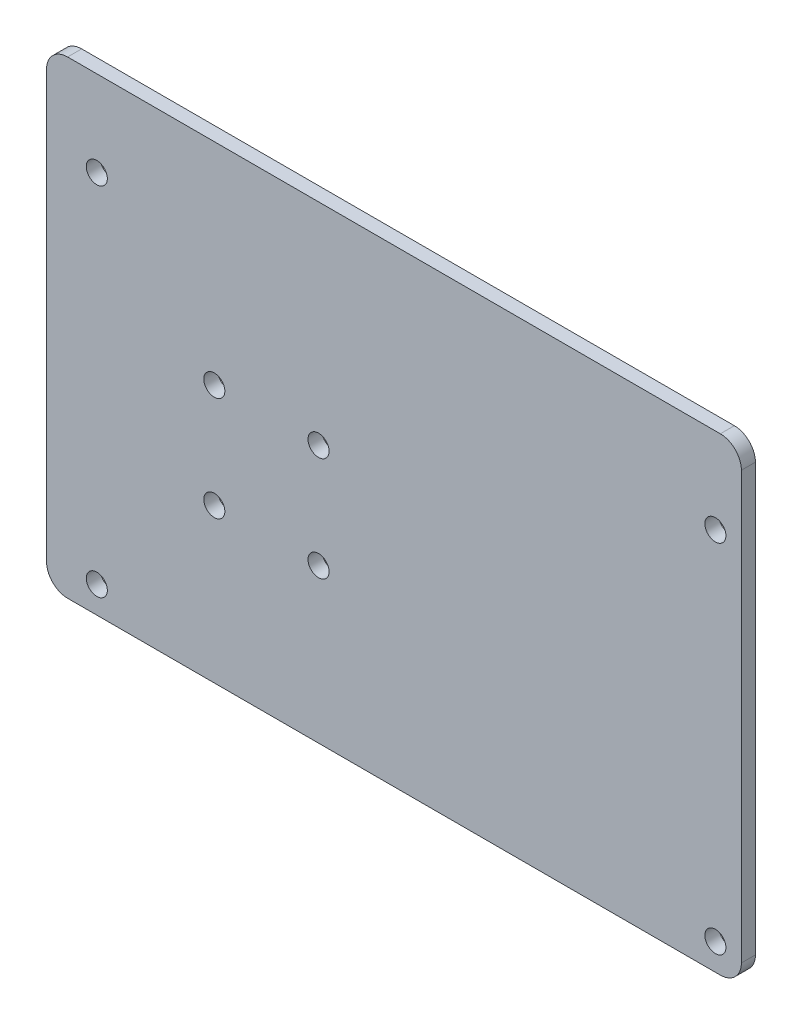
ISO-10303-21;
HEADER;
FILE_DESCRIPTION(('STEP AP214'),'2;1');
FILE_NAME('part.step','',(''),(''),'','','');
FILE_SCHEMA(('AUTOMOTIVE_DESIGN { 1 0 10303 214 1 1 1 1 }'));
ENDSEC;
DATA;
#1=APPLICATION_CONTEXT('core data for automotive mechanical design processes');
#2=APPLICATION_PROTOCOL_DEFINITION('international standard','automotive_design',2000,#1);
#3=PRODUCT_CONTEXT('',#1,'mechanical');
#4=PRODUCT('Part','Part','',(#3));
#5=PRODUCT_RELATED_PRODUCT_CATEGORY('part','',(#4));
#6=PRODUCT_DEFINITION_FORMATION('','',#4);
#7=PRODUCT_DEFINITION_CONTEXT('part definition',#1,'design');
#8=PRODUCT_DEFINITION('design','',#6,#7);
#9=PRODUCT_DEFINITION_SHAPE('','',#8);
#10=(LENGTH_UNIT() NAMED_UNIT(*) SI_UNIT(.MILLI.,.METRE.));
#11=(NAMED_UNIT(*) PLANE_ANGLE_UNIT() SI_UNIT($,.RADIAN.));
#12=(NAMED_UNIT(*) SI_UNIT($,.STERADIAN.) SOLID_ANGLE_UNIT());
#13=UNCERTAINTY_MEASURE_WITH_UNIT(LENGTH_MEASURE(1.E-05),#10,'distance_accuracy_value','');
#14=(GEOMETRIC_REPRESENTATION_CONTEXT(3) GLOBAL_UNCERTAINTY_ASSIGNED_CONTEXT((#13)) GLOBAL_UNIT_ASSIGNED_CONTEXT((#10,
#11,#12)) REPRESENTATION_CONTEXT('',''));
#15=CARTESIAN_POINT('',(0.,0.,0.));
#16=DIRECTION('',(0.,0.,1.));
#17=DIRECTION('',(1.,0.,0.));
#18=AXIS2_PLACEMENT_3D('',#15,#16,#17);
#19=CARTESIAN_POINT('',(43.9295938104449,23.2936170212766,2.));
#20=DIRECTION('',(0.,0.,-1.));
#21=DIRECTION('',(-1.,0.,0.));
#22=AXIS2_PLACEMENT_3D('',#19,#20,#21);
#23=CYLINDRICAL_SURFACE('',#22,3.);
#24=CARTESIAN_POINT('',(43.9295938104449,23.2936170212766,0.));
#25=DIRECTION('',(0.,0.,1.));
#26=DIRECTION('',(1.,0.,0.));
#27=AXIS2_PLACEMENT_3D('',#24,#25,#26);
#28=CIRCLE('',#27,3.);
#29=CARTESIAN_POINT('',(46.9295938104449,23.2936170212766,0.));
#30=VERTEX_POINT('',#29);
#31=CARTESIAN_POINT('',(43.9295938104449,26.2936170212766,0.));
#32=VERTEX_POINT('',#31);
#33=EDGE_CURVE('E141',#30,#32,#28,.T.);
#34=ORIENTED_EDGE('',*,*,#33,.T.);
#35=DIRECTION('',(0.,0.,-1.));
#36=VECTOR('',#35,1.);
#37=CARTESIAN_POINT('',(43.9295938104449,26.2936170212766,2.));
#38=LINE('',#37,#36);
#39=CARTESIAN_POINT('',(43.9295938104449,26.2936170212766,2.));
#40=VERTEX_POINT('',#39);
#41=EDGE_CURVE('E11',#40,#32,#38,.T.);
#42=ORIENTED_EDGE('',*,*,#41,.F.);
#43=CARTESIAN_POINT('',(43.9295938104449,23.2936170212766,2.));
#44=DIRECTION('',(0.,0.,1.));
#45=DIRECTION('',(1.,0.,0.));
#46=AXIS2_PLACEMENT_3D('',#43,#44,#45);
#47=CIRCLE('',#46,3.);
#48=CARTESIAN_POINT('',(46.9295938104449,23.2936170212766,2.));
#49=VERTEX_POINT('',#48);
#50=EDGE_CURVE('E156',#49,#40,#47,.T.);
#51=ORIENTED_EDGE('',*,*,#50,.F.);
#52=DIRECTION('',(0.,0.,-1.));
#53=VECTOR('',#52,1.);
#54=CARTESIAN_POINT('',(46.9295938104449,23.2936170212766,2.));
#55=LINE('',#54,#53);
#56=EDGE_CURVE('E137',#49,#30,#55,.T.);
#57=ORIENTED_EDGE('',*,*,#56,.T.);
#58=EDGE_LOOP('',(#34,#42,#51,#57));
#59=FACE_BOUND('',#58,.T.);
#60=ADVANCED_FACE('F45',(#59),#23,.T.);
#61=CARTESIAN_POINT('',(-49.0704061895551,26.2936170212766,2.));
#62=DIRECTION('',(0.,-1.,0.));
#63=DIRECTION('',(0.,0.,-1.));
#64=AXIS2_PLACEMENT_3D('',#61,#62,#63);
#65=PLANE('',#64);
#66=DIRECTION('',(-1.,0.,0.));
#67=VECTOR('',#66,1.);
#68=CARTESIAN_POINT('',(-49.0704061895551,26.2936170212766,0.));
#69=LINE('',#68,#67);
#70=CARTESIAN_POINT('',(-49.0704061895551,26.2936170212766,0.));
#71=VERTEX_POINT('',#70);
#72=EDGE_CURVE('E144',#32,#71,#69,.T.);
#73=ORIENTED_EDGE('',*,*,#72,.T.);
#74=DIRECTION('',(0.,0.,-1.));
#75=VECTOR('',#74,1.);
#76=CARTESIAN_POINT('',(-49.0704061895551,26.2936170212766,2.));
#77=LINE('',#76,#75);
#78=CARTESIAN_POINT('',(-49.0704061895551,26.2936170212766,2.));
#79=VERTEX_POINT('',#78);
#80=EDGE_CURVE('E53',#79,#71,#77,.T.);
#81=ORIENTED_EDGE('',*,*,#80,.F.);
#82=DIRECTION('',(-1.,0.,0.));
#83=VECTOR('',#82,1.);
#84=CARTESIAN_POINT('',(-49.0704061895551,26.2936170212766,2.));
#85=LINE('',#84,#83);
#86=EDGE_CURVE('E104',#40,#79,#85,.T.);
#87=ORIENTED_EDGE('',*,*,#86,.F.);
#88=ORIENTED_EDGE('',*,*,#41,.T.);
#89=EDGE_LOOP('',(#73,#81,#87,#88));
#90=FACE_BOUND('',#89,.T.);
#91=ADVANCED_FACE('F267',(#90),#65,.F.);
#92=CARTESIAN_POINT('',(-49.0704061895551,23.2936170212766,2.));
#93=DIRECTION('',(0.,0.,-1.));
#94=DIRECTION('',(-1.,0.,0.));
#95=AXIS2_PLACEMENT_3D('',#92,#93,#94);
#96=CYLINDRICAL_SURFACE('',#95,3.);
#97=CARTESIAN_POINT('',(-49.0704061895551,23.2936170212766,0.));
#98=DIRECTION('',(0.,0.,1.));
#99=DIRECTION('',(-1.,0.,0.));
#100=AXIS2_PLACEMENT_3D('',#97,#98,#99);
#101=CIRCLE('',#100,3.);
#102=CARTESIAN_POINT('',(-52.0704061895551,23.2936170212766,0.));
#103=VERTEX_POINT('',#102);
#104=EDGE_CURVE('E147',#71,#103,#101,.T.);
#105=ORIENTED_EDGE('',*,*,#104,.T.);
#106=DIRECTION('',(0.,0.,-1.));
#107=VECTOR('',#106,1.);
#108=CARTESIAN_POINT('',(-52.0704061895551,23.2936170212766,2.));
#109=LINE('',#108,#107);
#110=CARTESIAN_POINT('',(-52.0704061895551,23.2936170212766,2.));
#111=VERTEX_POINT('',#110);
#112=EDGE_CURVE('E163',#111,#103,#109,.T.);
#113=ORIENTED_EDGE('',*,*,#112,.F.);
#114=CARTESIAN_POINT('',(-49.0704061895551,23.2936170212766,2.));
#115=DIRECTION('',(0.,0.,1.));
#116=DIRECTION('',(-1.,0.,0.));
#117=AXIS2_PLACEMENT_3D('',#114,#115,#116);
#118=CIRCLE('',#117,3.);
#119=EDGE_CURVE('E171',#79,#111,#118,.T.);
#120=ORIENTED_EDGE('',*,*,#119,.F.);
#121=ORIENTED_EDGE('',*,*,#80,.T.);
#122=EDGE_LOOP('',(#105,#113,#120,#121));
#123=FACE_BOUND('',#122,.T.);
#124=ADVANCED_FACE('F169',(#123),#96,.T.);
#125=CARTESIAN_POINT('',(-52.0704061895551,23.2936170212766,2.));
#126=DIRECTION('',(1.,0.,0.));
#127=DIRECTION('',(0.,0.,-1.));
#128=AXIS2_PLACEMENT_3D('',#125,#126,#127);
#129=PLANE('',#128);
#130=DIRECTION('',(0.,-1.,0.));
#131=VECTOR('',#130,1.);
#132=CARTESIAN_POINT('',(-52.0704061895551,23.2936170212766,0.));
#133=LINE('',#132,#131);
#134=CARTESIAN_POINT('',(-52.0704061895551,-37.5063829787234,0.));
#135=VERTEX_POINT('',#134);
#136=EDGE_CURVE('E149',#103,#135,#133,.T.);
#137=ORIENTED_EDGE('',*,*,#136,.T.);
#138=DIRECTION('',(0.,0.,-1.));
#139=VECTOR('',#138,1.);
#140=CARTESIAN_POINT('',(-52.0704061895551,-37.5063829787234,2.));
#141=LINE('',#140,#139);
#142=CARTESIAN_POINT('',(-52.0704061895551,-37.5063829787234,2.));
#143=VERTEX_POINT('',#142);
#144=EDGE_CURVE('E160',#143,#135,#141,.T.);
#145=ORIENTED_EDGE('',*,*,#144,.F.);
#146=DIRECTION('',(0.,-1.,0.));
#147=VECTOR('',#146,1.);
#148=CARTESIAN_POINT('',(-52.0704061895551,23.2936170212766,2.));
#149=LINE('',#148,#147);
#150=EDGE_CURVE('E183',#111,#143,#149,.T.);
#151=ORIENTED_EDGE('',*,*,#150,.F.);
#152=ORIENTED_EDGE('',*,*,#112,.T.);
#153=EDGE_LOOP('',(#137,#145,#151,#152));
#154=FACE_BOUND('',#153,.T.);
#155=ADVANCED_FACE('F179',(#154),#129,.F.);
#156=CARTESIAN_POINT('',(-49.0704061895551,-37.5063829787234,2.));
#157=DIRECTION('',(0.,0.,-1.));
#158=DIRECTION('',(-1.,0.,0.));
#159=AXIS2_PLACEMENT_3D('',#156,#157,#158);
#160=CYLINDRICAL_SURFACE('',#159,3.);
#161=CARTESIAN_POINT('',(-49.0704061895551,-37.5063829787234,0.));
#162=DIRECTION('',(0.,0.,1.));
#163=DIRECTION('',(-1.,0.,0.));
#164=AXIS2_PLACEMENT_3D('',#161,#162,#163);
#165=CIRCLE('',#164,3.);
#166=CARTESIAN_POINT('',(-49.0704061895551,-40.5063829787234,0.));
#167=VERTEX_POINT('',#166);
#168=EDGE_CURVE('E151',#135,#167,#165,.T.);
#169=ORIENTED_EDGE('',*,*,#168,.T.);
#170=DIRECTION('',(0.,0.,-1.));
#171=VECTOR('',#170,1.);
#172=CARTESIAN_POINT('',(-49.0704061895551,-40.5063829787234,2.));
#173=LINE('',#172,#171);
#174=CARTESIAN_POINT('',(-49.0704061895551,-40.5063829787234,2.));
#175=VERTEX_POINT('',#174);
#176=EDGE_CURVE('E132',#175,#167,#173,.T.);
#177=ORIENTED_EDGE('',*,*,#176,.F.);
#178=CARTESIAN_POINT('',(-49.0704061895551,-37.5063829787234,2.));
#179=DIRECTION('',(0.,0.,1.));
#180=DIRECTION('',(-1.,0.,0.));
#181=AXIS2_PLACEMENT_3D('',#178,#179,#180);
#182=CIRCLE('',#181,3.);
#183=EDGE_CURVE('E123',#143,#175,#182,.T.);
#184=ORIENTED_EDGE('',*,*,#183,.F.);
#185=ORIENTED_EDGE('',*,*,#144,.T.);
#186=EDGE_LOOP('',(#169,#177,#184,#185));
#187=FACE_BOUND('',#186,.T.);
#188=ADVANCED_FACE('F182',(#187),#160,.T.);
#189=CARTESIAN_POINT('',(-49.0704061895551,-40.5063829787234,2.));
#190=DIRECTION('',(0.,1.,0.));
#191=DIRECTION('',(-1.,0.,0.));
#192=AXIS2_PLACEMENT_3D('',#189,#190,#191);
#193=PLANE('',#192);
#194=DIRECTION('',(1.,0.,0.));
#195=VECTOR('',#194,1.);
#196=CARTESIAN_POINT('',(-49.0704061895551,-40.5063829787234,0.));
#197=LINE('',#196,#195);
#198=CARTESIAN_POINT('',(43.9295938104449,-40.5063829787234,0.));
#199=VERTEX_POINT('',#198);
#200=EDGE_CURVE('E131',#167,#199,#197,.T.);
#201=ORIENTED_EDGE('',*,*,#200,.T.);
#202=DIRECTION('',(0.,0.,-1.));
#203=VECTOR('',#202,1.);
#204=CARTESIAN_POINT('',(43.9295938104449,-40.5063829787234,2.));
#205=LINE('',#204,#203);
#206=CARTESIAN_POINT('',(43.9295938104449,-40.5063829787234,2.));
#207=VERTEX_POINT('',#206);
#208=EDGE_CURVE('E128',#207,#199,#205,.T.);
#209=ORIENTED_EDGE('',*,*,#208,.F.);
#210=DIRECTION('',(1.,0.,0.));
#211=VECTOR('',#210,1.);
#212=CARTESIAN_POINT('',(-49.0704061895551,-40.5063829787234,2.));
#213=LINE('',#212,#211);
#214=EDGE_CURVE('E117',#175,#207,#213,.T.);
#215=ORIENTED_EDGE('',*,*,#214,.F.);
#216=ORIENTED_EDGE('',*,*,#176,.T.);
#217=EDGE_LOOP('',(#201,#209,#215,#216));
#218=FACE_BOUND('',#217,.T.);
#219=ADVANCED_FACE('F129',(#218),#193,.F.);
#220=CARTESIAN_POINT('',(43.9295938104449,-37.5063829787234,2.));
#221=DIRECTION('',(0.,0.,-1.));
#222=DIRECTION('',(-1.,0.,0.));
#223=AXIS2_PLACEMENT_3D('',#220,#221,#222);
#224=CYLINDRICAL_SURFACE('',#223,3.);
#225=CARTESIAN_POINT('',(43.9295938104449,-37.5063829787234,0.));
#226=DIRECTION('',(0.,0.,1.));
#227=DIRECTION('',(1.,0.,0.));
#228=AXIS2_PLACEMENT_3D('',#225,#226,#227);
#229=CIRCLE('',#228,3.);
#230=CARTESIAN_POINT('',(46.9295938104449,-37.5063829787234,0.));
#231=VERTEX_POINT('',#230);
#232=EDGE_CURVE('E90',#199,#231,#229,.T.);
#233=ORIENTED_EDGE('',*,*,#232,.T.);
#234=DIRECTION('',(0.,0.,-1.));
#235=VECTOR('',#234,1.);
#236=CARTESIAN_POINT('',(46.9295938104449,-37.5063829787234,2.));
#237=LINE('',#236,#235);
#238=CARTESIAN_POINT('',(46.9295938104449,-37.5063829787234,2.));
#239=VERTEX_POINT('',#238);
#240=EDGE_CURVE('E133',#239,#231,#237,.T.);
#241=ORIENTED_EDGE('',*,*,#240,.F.);
#242=CARTESIAN_POINT('',(43.9295938104449,-37.5063829787234,2.));
#243=DIRECTION('',(0.,0.,1.));
#244=DIRECTION('',(1.,0.,0.));
#245=AXIS2_PLACEMENT_3D('',#242,#243,#244);
#246=CIRCLE('',#245,3.);
#247=EDGE_CURVE('E121',#207,#239,#246,.T.);
#248=ORIENTED_EDGE('',*,*,#247,.F.);
#249=ORIENTED_EDGE('',*,*,#208,.T.);
#250=EDGE_LOOP('',(#233,#241,#248,#249));
#251=FACE_BOUND('',#250,.T.);
#252=ADVANCED_FACE('F135',(#251),#224,.T.);
#253=CARTESIAN_POINT('',(46.9295938104449,23.2936170212766,2.));
#254=DIRECTION('',(-1.,0.,0.));
#255=DIRECTION('',(0.,-1.,0.));
#256=AXIS2_PLACEMENT_3D('',#253,#254,#255);
#257=PLANE('',#256);
#258=DIRECTION('',(0.,1.,0.));
#259=VECTOR('',#258,1.);
#260=CARTESIAN_POINT('',(46.9295938104449,23.2936170212766,0.));
#261=LINE('',#260,#259);
#262=EDGE_CURVE('E96',#231,#30,#261,.T.);
#263=ORIENTED_EDGE('',*,*,#262,.T.);
#264=ORIENTED_EDGE('',*,*,#56,.F.);
#265=DIRECTION('',(0.,1.,0.));
#266=VECTOR('',#265,1.);
#267=CARTESIAN_POINT('',(46.9295938104449,23.2936170212766,2.));
#268=LINE('',#267,#266);
#269=EDGE_CURVE('E61',#239,#49,#268,.T.);
#270=ORIENTED_EDGE('',*,*,#269,.F.);
#271=ORIENTED_EDGE('',*,*,#240,.T.);
#272=EDGE_LOOP('',(#263,#264,#270,#271));
#273=FACE_BOUND('',#272,.T.);
#274=ADVANCED_FACE('F241',(#273),#257,.F.);
#275=CARTESIAN_POINT('',(43.9295938104449,23.2936170212766,2.));
#276=DIRECTION('',(0.,0.,1.));
#277=DIRECTION('',(1.,0.,0.));
#278=AXIS2_PLACEMENT_3D('',#275,#276,#277);
#279=PLANE('',#278);
#280=CARTESIAN_POINT('',(-44.9144061895551,14.1016170212766,2.));
#281=DIRECTION('',(0.,0.,1.));
#282=DIRECTION('',(1.,0.,0.));
#283=AXIS2_PLACEMENT_3D('',#280,#281,#282);
#284=CIRCLE('',#283,1.5);
#285=CARTESIAN_POINT('',(-43.4144061895551,14.1016170212766,2.));
#286=VERTEX_POINT('',#285);
#287=EDGE_CURVE('E192',#286,#286,#284,.T.);
#288=ORIENTED_EDGE('',*,*,#287,.F.);
#289=EDGE_LOOP('',(#288));
#290=FACE_BOUND('',#289,.T.);
#291=CARTESIAN_POINT('',(-44.9144061895551,-36.6983829787234,2.));
#292=DIRECTION('',(0.,0.,1.));
#293=DIRECTION('',(1.,0.,0.));
#294=AXIS2_PLACEMENT_3D('',#291,#292,#293);
#295=CIRCLE('',#294,1.5);
#296=CARTESIAN_POINT('',(-43.4144061895551,-36.6983829787234,2.));
#297=VERTEX_POINT('',#296);
#298=EDGE_CURVE('E211',#297,#297,#295,.T.);
#299=ORIENTED_EDGE('',*,*,#298,.F.);
#300=EDGE_LOOP('',(#299));
#301=FACE_BOUND('',#300,.T.);
#302=CARTESIAN_POINT('',(43.2255938104449,-36.6983829787234,2.));
#303=DIRECTION('',(0.,0.,1.));
#304=DIRECTION('',(1.,0.,0.));
#305=AXIS2_PLACEMENT_3D('',#302,#303,#304);
#306=CIRCLE('',#305,1.5);
#307=CARTESIAN_POINT('',(44.7255938104449,-36.6983829787234,2.));
#308=VERTEX_POINT('',#307);
#309=EDGE_CURVE('E205',#308,#308,#306,.T.);
#310=ORIENTED_EDGE('',*,*,#309,.F.);
#311=EDGE_LOOP('',(#310));
#312=FACE_BOUND('',#311,.T.);
#313=CARTESIAN_POINT('',(-28.1704061895551,-3.74514057380588,2.));
#314=DIRECTION('',(0.,0.,1.));
#315=DIRECTION('',(1.,0.,0.));
#316=AXIS2_PLACEMENT_3D('',#313,#314,#315);
#317=CIRCLE('',#316,1.5);
#318=CARTESIAN_POINT('',(-26.6704061895551,-3.74514057380588,2.));
#319=VERTEX_POINT('',#318);
#320=EDGE_CURVE('E198',#319,#319,#317,.T.);
#321=ORIENTED_EDGE('',*,*,#320,.F.);
#322=EDGE_LOOP('',(#321));
#323=FACE_BOUND('',#322,.T.);
#324=CARTESIAN_POINT('',(-13.3211637846376,-18.5943829787234,2.));
#325=DIRECTION('',(0.,0.,1.));
#326=DIRECTION('',(1.,0.,0.));
#327=AXIS2_PLACEMENT_3D('',#324,#325,#326);
#328=CIRCLE('',#327,1.5);
#329=CARTESIAN_POINT('',(-11.8211637846376,-18.5943829787234,2.));
#330=VERTEX_POINT('',#329);
#331=EDGE_CURVE('E223',#330,#330,#328,.T.);
#332=ORIENTED_EDGE('',*,*,#331,.F.);
#333=EDGE_LOOP('',(#332));
#334=FACE_BOUND('',#333,.T.);
#335=CARTESIAN_POINT('',(-13.3211637846376,-3.74514057380588,2.));
#336=DIRECTION('',(0.,0.,1.));
#337=DIRECTION('',(1.,0.,0.));
#338=AXIS2_PLACEMENT_3D('',#335,#336,#337);
#339=CIRCLE('',#338,1.5);
#340=CARTESIAN_POINT('',(-11.8211637846376,-3.74514057380588,2.));
#341=VERTEX_POINT('',#340);
#342=EDGE_CURVE('E222',#341,#341,#339,.T.);
#343=ORIENTED_EDGE('',*,*,#342,.F.);
#344=EDGE_LOOP('',(#343));
#345=FACE_BOUND('',#344,.T.);
#346=CARTESIAN_POINT('',(-28.1704061895551,-18.5943829787234,2.));
#347=DIRECTION('',(0.,0.,1.));
#348=DIRECTION('',(1.,0.,0.));
#349=AXIS2_PLACEMENT_3D('',#346,#347,#348);
#350=CIRCLE('',#349,1.5);
#351=CARTESIAN_POINT('',(-26.6704061895551,-18.5943829787234,2.));
#352=VERTEX_POINT('',#351);
#353=EDGE_CURVE('E199',#352,#352,#350,.T.);
#354=ORIENTED_EDGE('',*,*,#353,.F.);
#355=EDGE_LOOP('',(#354));
#356=FACE_BOUND('',#355,.T.);
#357=CARTESIAN_POINT('',(43.2255938104449,14.1016170212766,2.));
#358=DIRECTION('',(0.,0.,1.));
#359=DIRECTION('',(1.,0.,0.));
#360=AXIS2_PLACEMENT_3D('',#357,#358,#359);
#361=CIRCLE('',#360,1.5);
#362=CARTESIAN_POINT('',(44.7255938104449,14.1016170212766,2.));
#363=VERTEX_POINT('',#362);
#364=EDGE_CURVE('E189',#363,#363,#361,.T.);
#365=ORIENTED_EDGE('',*,*,#364,.F.);
#366=EDGE_LOOP('',(#365));
#367=FACE_BOUND('',#366,.T.);
#368=ORIENTED_EDGE('',*,*,#50,.T.);
#369=ORIENTED_EDGE('',*,*,#86,.T.);
#370=ORIENTED_EDGE('',*,*,#119,.T.);
#371=ORIENTED_EDGE('',*,*,#150,.T.);
#372=ORIENTED_EDGE('',*,*,#183,.T.);
#373=ORIENTED_EDGE('',*,*,#214,.T.);
#374=ORIENTED_EDGE('',*,*,#247,.T.);
#375=ORIENTED_EDGE('',*,*,#269,.T.);
#376=EDGE_LOOP('',(#368,#369,#370,#371,#372,#373,#374,#375));
#377=FACE_BOUND('',#376,.T.);
#378=ADVANCED_FACE('F119',(#290,#301,#312,#323,#334,#345,#356,#367,#377),#279,.T.);
#379=CARTESIAN_POINT('',(43.9295938104449,23.2936170212766,0.));
#380=DIRECTION('',(0.,0.,1.));
#381=DIRECTION('',(1.,0.,0.));
#382=AXIS2_PLACEMENT_3D('',#379,#380,#381);
#383=PLANE('',#382);
#384=CARTESIAN_POINT('',(-44.9144061895551,14.1016170212766,0.));
#385=DIRECTION('',(0.,0.,1.));
#386=DIRECTION('',(1.,0.,0.));
#387=AXIS2_PLACEMENT_3D('',#384,#385,#386);
#388=CIRCLE('',#387,1.5);
#389=CARTESIAN_POINT('',(-43.4144061895551,14.1016170212766,0.));
#390=VERTEX_POINT('',#389);
#391=EDGE_CURVE('E214',#390,#390,#388,.T.);
#392=ORIENTED_EDGE('',*,*,#391,.T.);
#393=EDGE_LOOP('',(#392));
#394=FACE_BOUND('',#393,.T.);
#395=CARTESIAN_POINT('',(-44.9144061895551,-36.6983829787234,0.));
#396=DIRECTION('',(0.,0.,1.));
#397=DIRECTION('',(1.,0.,0.));
#398=AXIS2_PLACEMENT_3D('',#395,#396,#397);
#399=CIRCLE('',#398,1.5);
#400=CARTESIAN_POINT('',(-43.4144061895551,-36.6983829787234,0.));
#401=VERTEX_POINT('',#400);
#402=EDGE_CURVE('E208',#401,#401,#399,.T.);
#403=ORIENTED_EDGE('',*,*,#402,.T.);
#404=EDGE_LOOP('',(#403));
#405=FACE_BOUND('',#404,.T.);
#406=CARTESIAN_POINT('',(43.2255938104449,-36.6983829787234,0.));
#407=DIRECTION('',(0.,0.,1.));
#408=DIRECTION('',(1.,0.,0.));
#409=AXIS2_PLACEMENT_3D('',#406,#407,#408);
#410=CIRCLE('',#409,1.5);
#411=CARTESIAN_POINT('',(44.7255938104449,-36.6983829787234,0.));
#412=VERTEX_POINT('',#411);
#413=EDGE_CURVE('E202',#412,#412,#410,.T.);
#414=ORIENTED_EDGE('',*,*,#413,.T.);
#415=EDGE_LOOP('',(#414));
#416=FACE_BOUND('',#415,.T.);
#417=CARTESIAN_POINT('',(-28.1704061895551,-3.74514057380588,0.));
#418=DIRECTION('',(0.,0.,1.));
#419=DIRECTION('',(1.,0.,0.));
#420=AXIS2_PLACEMENT_3D('',#417,#418,#419);
#421=CIRCLE('',#420,1.5);
#422=CARTESIAN_POINT('',(-26.6704061895551,-3.74514057380588,0.));
#423=VERTEX_POINT('',#422);
#424=EDGE_CURVE('E195',#423,#423,#421,.T.);
#425=ORIENTED_EDGE('',*,*,#424,.T.);
#426=EDGE_LOOP('',(#425));
#427=FACE_BOUND('',#426,.T.);
#428=CARTESIAN_POINT('',(-13.3211637846376,-18.5943829787234,0.));
#429=DIRECTION('',(0.,0.,1.));
#430=DIRECTION('',(1.,0.,0.));
#431=AXIS2_PLACEMENT_3D('',#428,#429,#430);
#432=CIRCLE('',#431,1.5);
#433=CARTESIAN_POINT('',(-11.8211637846376,-18.5943829787234,0.));
#434=VERTEX_POINT('',#433);
#435=EDGE_CURVE('E231',#434,#434,#432,.T.);
#436=ORIENTED_EDGE('',*,*,#435,.T.);
#437=EDGE_LOOP('',(#436));
#438=FACE_BOUND('',#437,.T.);
#439=CARTESIAN_POINT('',(-13.3211637846376,-3.74514057380588,0.));
#440=DIRECTION('',(0.,0.,1.));
#441=DIRECTION('',(1.,0.,0.));
#442=AXIS2_PLACEMENT_3D('',#439,#440,#441);
#443=CIRCLE('',#442,1.5);
#444=CARTESIAN_POINT('',(-11.8211637846376,-3.74514057380588,0.));
#445=VERTEX_POINT('',#444);
#446=EDGE_CURVE('E219',#445,#445,#443,.T.);
#447=ORIENTED_EDGE('',*,*,#446,.T.);
#448=EDGE_LOOP('',(#447));
#449=FACE_BOUND('',#448,.T.);
#450=CARTESIAN_POINT('',(-28.1704061895551,-18.5943829787234,0.));
#451=DIRECTION('',(0.,0.,1.));
#452=DIRECTION('',(1.,0.,0.));
#453=AXIS2_PLACEMENT_3D('',#450,#451,#452);
#454=CIRCLE('',#453,1.5);
#455=CARTESIAN_POINT('',(-26.6704061895551,-18.5943829787234,0.));
#456=VERTEX_POINT('',#455);
#457=EDGE_CURVE('E226',#456,#456,#454,.T.);
#458=ORIENTED_EDGE('',*,*,#457,.T.);
#459=EDGE_LOOP('',(#458));
#460=FACE_BOUND('',#459,.T.);
#461=CARTESIAN_POINT('',(43.2255938104449,14.1016170212766,0.));
#462=DIRECTION('',(0.,0.,1.));
#463=DIRECTION('',(1.,0.,0.));
#464=AXIS2_PLACEMENT_3D('',#461,#462,#463);
#465=CIRCLE('',#464,1.5);
#466=CARTESIAN_POINT('',(44.7255938104449,14.1016170212766,0.));
#467=VERTEX_POINT('',#466);
#468=EDGE_CURVE('E145',#467,#467,#465,.T.);
#469=ORIENTED_EDGE('',*,*,#468,.T.);
#470=EDGE_LOOP('',(#469));
#471=FACE_BOUND('',#470,.T.);
#472=ORIENTED_EDGE('',*,*,#33,.F.);
#473=ORIENTED_EDGE('',*,*,#262,.F.);
#474=ORIENTED_EDGE('',*,*,#232,.F.);
#475=ORIENTED_EDGE('',*,*,#200,.F.);
#476=ORIENTED_EDGE('',*,*,#168,.F.);
#477=ORIENTED_EDGE('',*,*,#136,.F.);
#478=ORIENTED_EDGE('',*,*,#104,.F.);
#479=ORIENTED_EDGE('',*,*,#72,.F.);
#480=EDGE_LOOP('',(#472,#473,#474,#475,#476,#477,#478,#479));
#481=FACE_BOUND('',#480,.T.);
#482=ADVANCED_FACE('F175',(#394,#405,#416,#427,#438,#449,#460,#471,#481),#383,.F.);
#483=CARTESIAN_POINT('',(43.2255938104449,14.1016170212766,0.));
#484=DIRECTION('',(0.,0.,1.));
#485=DIRECTION('',(1.,0.,0.));
#486=AXIS2_PLACEMENT_3D('',#483,#484,#485);
#487=CYLINDRICAL_SURFACE('',#486,1.5);
#488=ORIENTED_EDGE('',*,*,#468,.F.);
#489=EDGE_LOOP('',(#488));
#490=FACE_BOUND('',#489,.T.);
#491=ORIENTED_EDGE('',*,*,#364,.T.);
#492=EDGE_LOOP('',(#491));
#493=FACE_BOUND('',#492,.T.);
#494=ADVANCED_FACE('F250',(#490,#493),#487,.F.);
#495=CARTESIAN_POINT('',(-28.1704061895551,-18.5943829787234,0.));
#496=DIRECTION('',(0.,0.,1.));
#497=DIRECTION('',(1.,0.,0.));
#498=AXIS2_PLACEMENT_3D('',#495,#496,#497);
#499=CYLINDRICAL_SURFACE('',#498,1.5);
#500=ORIENTED_EDGE('',*,*,#457,.F.);
#501=EDGE_LOOP('',(#500));
#502=FACE_BOUND('',#501,.T.);
#503=ORIENTED_EDGE('',*,*,#353,.T.);
#504=EDGE_LOOP('',(#503));
#505=FACE_BOUND('',#504,.T.);
#506=ADVANCED_FACE('F252',(#502,#505),#499,.F.);
#507=CARTESIAN_POINT('',(-13.3211637846376,-3.74514057380588,0.));
#508=DIRECTION('',(0.,0.,1.));
#509=DIRECTION('',(1.,0.,0.));
#510=AXIS2_PLACEMENT_3D('',#507,#508,#509);
#511=CYLINDRICAL_SURFACE('',#510,1.5);
#512=ORIENTED_EDGE('',*,*,#446,.F.);
#513=EDGE_LOOP('',(#512));
#514=FACE_BOUND('',#513,.T.);
#515=ORIENTED_EDGE('',*,*,#342,.T.);
#516=EDGE_LOOP('',(#515));
#517=FACE_BOUND('',#516,.T.);
#518=ADVANCED_FACE('F259',(#514,#517),#511,.F.);
#519=CARTESIAN_POINT('',(-13.3211637846376,-18.5943829787234,0.));
#520=DIRECTION('',(0.,0.,1.));
#521=DIRECTION('',(1.,0.,0.));
#522=AXIS2_PLACEMENT_3D('',#519,#520,#521);
#523=CYLINDRICAL_SURFACE('',#522,1.5);
#524=ORIENTED_EDGE('',*,*,#435,.F.);
#525=EDGE_LOOP('',(#524));
#526=FACE_BOUND('',#525,.T.);
#527=ORIENTED_EDGE('',*,*,#331,.T.);
#528=EDGE_LOOP('',(#527));
#529=FACE_BOUND('',#528,.T.);
#530=ADVANCED_FACE('F237',(#526,#529),#523,.F.);
#531=CARTESIAN_POINT('',(-28.1704061895551,-3.74514057380588,0.));
#532=DIRECTION('',(0.,0.,1.));
#533=DIRECTION('',(1.,0.,0.));
#534=AXIS2_PLACEMENT_3D('',#531,#532,#533);
#535=CYLINDRICAL_SURFACE('',#534,1.5);
#536=ORIENTED_EDGE('',*,*,#424,.F.);
#537=EDGE_LOOP('',(#536));
#538=FACE_BOUND('',#537,.T.);
#539=ORIENTED_EDGE('',*,*,#320,.T.);
#540=EDGE_LOOP('',(#539));
#541=FACE_BOUND('',#540,.T.);
#542=ADVANCED_FACE('F357',(#538,#541),#535,.F.);
#543=CARTESIAN_POINT('',(43.2255938104449,-36.6983829787234,0.));
#544=DIRECTION('',(0.,0.,1.));
#545=DIRECTION('',(1.,0.,0.));
#546=AXIS2_PLACEMENT_3D('',#543,#544,#545);
#547=CYLINDRICAL_SURFACE('',#546,1.5);
#548=ORIENTED_EDGE('',*,*,#413,.F.);
#549=EDGE_LOOP('',(#548));
#550=FACE_BOUND('',#549,.T.);
#551=ORIENTED_EDGE('',*,*,#309,.T.);
#552=EDGE_LOOP('',(#551));
#553=FACE_BOUND('',#552,.T.);
#554=ADVANCED_FACE('F367',(#550,#553),#547,.F.);
#555=CARTESIAN_POINT('',(-44.9144061895551,-36.6983829787234,0.));
#556=DIRECTION('',(0.,0.,1.));
#557=DIRECTION('',(1.,0.,0.));
#558=AXIS2_PLACEMENT_3D('',#555,#556,#557);
#559=CYLINDRICAL_SURFACE('',#558,1.5);
#560=ORIENTED_EDGE('',*,*,#402,.F.);
#561=EDGE_LOOP('',(#560));
#562=FACE_BOUND('',#561,.T.);
#563=ORIENTED_EDGE('',*,*,#298,.T.);
#564=EDGE_LOOP('',(#563));
#565=FACE_BOUND('',#564,.T.);
#566=ADVANCED_FACE('F376',(#562,#565),#559,.F.);
#567=CARTESIAN_POINT('',(-44.9144061895551,14.1016170212766,0.));
#568=DIRECTION('',(0.,0.,1.));
#569=DIRECTION('',(1.,0.,0.));
#570=AXIS2_PLACEMENT_3D('',#567,#568,#569);
#571=CYLINDRICAL_SURFACE('',#570,1.5);
#572=ORIENTED_EDGE('',*,*,#391,.F.);
#573=EDGE_LOOP('',(#572));
#574=FACE_BOUND('',#573,.T.);
#575=ORIENTED_EDGE('',*,*,#287,.T.);
#576=EDGE_LOOP('',(#575));
#577=FACE_BOUND('',#576,.T.);
#578=ADVANCED_FACE('F386',(#574,#577),#571,.F.);
#579=CLOSED_SHELL('',(#60,#91,#124,#155,#188,#219,#252,#274,#378,#482,#494,#506,#518,#530,#542,
#554,#566,#578));
#580=MANIFOLD_SOLID_BREP('B2',#579);
#581=ADVANCED_BREP_SHAPE_REPRESENTATION('',(#18,#580),#14);
#582=SHAPE_DEFINITION_REPRESENTATION(#9,#581);
ENDSEC;
END-ISO-10303-21;
